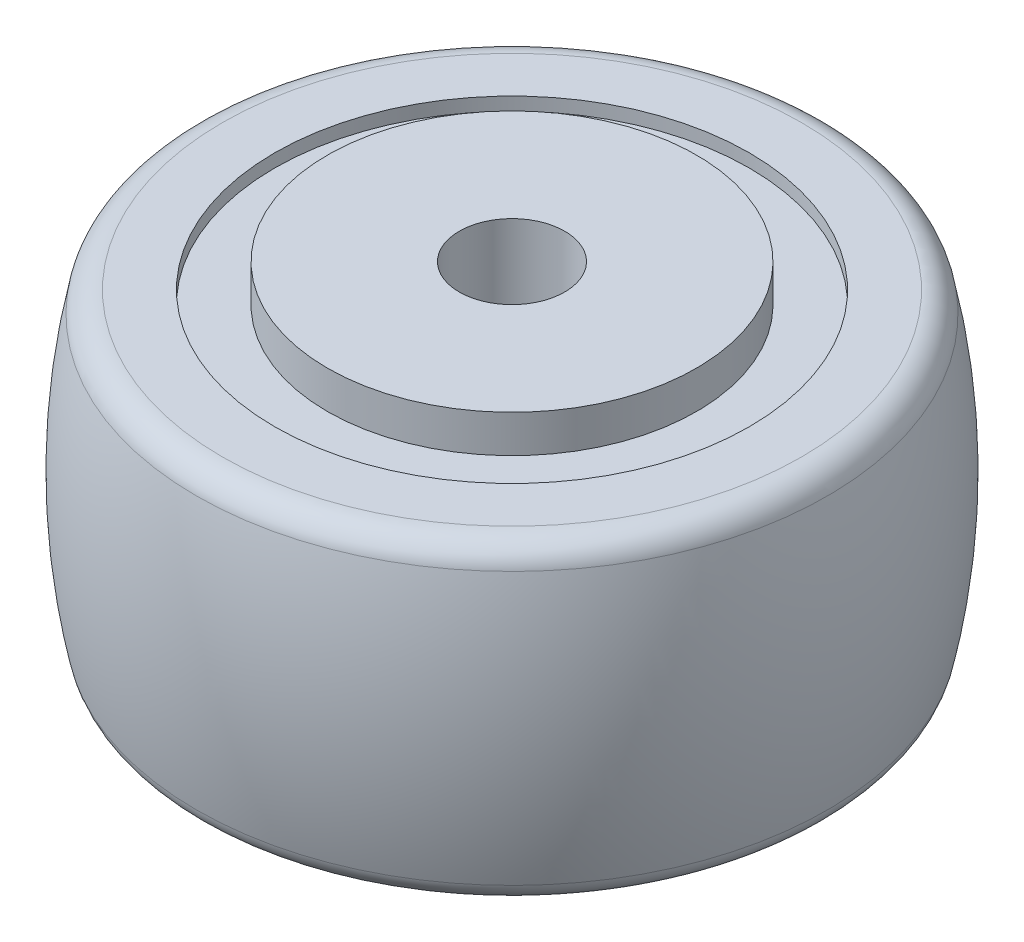
ISO-10303-21;
HEADER;
FILE_DESCRIPTION(('STEP AP214'),'2;1');
FILE_NAME('part.step','',(''),(''),'','','');
FILE_SCHEMA(('AUTOMOTIVE_DESIGN { 1 0 10303 214 1 1 1 1 }'));
ENDSEC;
DATA;
#1=APPLICATION_CONTEXT('core data for automotive mechanical design processes');
#2=APPLICATION_PROTOCOL_DEFINITION('international standard','automotive_design',2000,#1);
#3=PRODUCT_CONTEXT('',#1,'mechanical');
#4=PRODUCT('Part','Part','',(#3));
#5=PRODUCT_RELATED_PRODUCT_CATEGORY('part','',(#4));
#6=PRODUCT_DEFINITION_FORMATION('','',#4);
#7=PRODUCT_DEFINITION_CONTEXT('part definition',#1,'design');
#8=PRODUCT_DEFINITION('design','',#6,#7);
#9=PRODUCT_DEFINITION_SHAPE('','',#8);
#10=(LENGTH_UNIT() NAMED_UNIT(*) SI_UNIT(.MILLI.,.METRE.));
#11=(NAMED_UNIT(*) PLANE_ANGLE_UNIT() SI_UNIT($,.RADIAN.));
#12=(NAMED_UNIT(*) SI_UNIT($,.STERADIAN.) SOLID_ANGLE_UNIT());
#13=UNCERTAINTY_MEASURE_WITH_UNIT(LENGTH_MEASURE(1.E-05),#10,'distance_accuracy_value','');
#14=(GEOMETRIC_REPRESENTATION_CONTEXT(3) GLOBAL_UNCERTAINTY_ASSIGNED_CONTEXT((#13)) GLOBAL_UNIT_ASSIGNED_CONTEXT((#10,
#11,#12)) REPRESENTATION_CONTEXT('',''));
#15=CARTESIAN_POINT('',(0.,0.,0.));
#16=DIRECTION('',(0.,0.,1.));
#17=DIRECTION('',(1.,0.,0.));
#18=AXIS2_PLACEMENT_3D('',#15,#16,#17);
#19=CARTESIAN_POINT('',(0.,-13.75,0.));
#20=DIRECTION('',(0.,1.,0.));
#21=DIRECTION('',(0.,0.,1.));
#22=AXIS2_PLACEMENT_3D('',#19,#20,#21);
#23=CYLINDRICAL_SURFACE('',#22,14.);
#24=CARTESIAN_POINT('',(0.,-13.75,0.));
#25=DIRECTION('',(0.,1.,0.));
#26=DIRECTION('',(0.,0.,1.));
#27=AXIS2_PLACEMENT_3D('',#24,#25,#26);
#28=CIRCLE('',#27,14.);
#29=CARTESIAN_POINT('',(0.,-13.75,14.));
#30=VERTEX_POINT('',#29);
#31=EDGE_CURVE('E10',#30,#30,#28,.T.);
#32=ORIENTED_EDGE('',*,*,#31,.T.);
#33=EDGE_LOOP('',(#32));
#34=FACE_BOUND('',#33,.T.);
#35=CARTESIAN_POINT('',(0.,-10.9,0.));
#36=DIRECTION('',(0.,1.,0.));
#37=DIRECTION('',(0.,0.,1.));
#38=AXIS2_PLACEMENT_3D('',#35,#36,#37);
#39=CIRCLE('',#38,14.);
#40=CARTESIAN_POINT('',(0.,-10.9,14.));
#41=VERTEX_POINT('',#40);
#42=EDGE_CURVE('E105',#41,#41,#39,.T.);
#43=ORIENTED_EDGE('',*,*,#42,.F.);
#44=EDGE_LOOP('',(#43));
#45=FACE_BOUND('',#44,.T.);
#46=ADVANCED_FACE('F43',(#34,#45),#23,.T.);
#47=CARTESIAN_POINT('',(14.,-13.75,0.));
#48=DIRECTION('',(0.,-1.,0.));
#49=DIRECTION('',(0.,0.,-1.));
#50=AXIS2_PLACEMENT_3D('',#47,#48,#49);
#51=PLANE('',#50);
#52=CARTESIAN_POINT('',(0.,-13.75,0.));
#53=DIRECTION('',(0.,1.,0.));
#54=DIRECTION('',(0.,0.,1.));
#55=AXIS2_PLACEMENT_3D('',#52,#53,#54);
#56=CIRCLE('',#55,4.);
#57=CARTESIAN_POINT('',(0.,-13.75,4.));
#58=VERTEX_POINT('',#57);
#59=EDGE_CURVE('E49',#58,#58,#56,.T.);
#60=ORIENTED_EDGE('',*,*,#59,.T.);
#61=EDGE_LOOP('',(#60));
#62=FACE_BOUND('',#61,.T.);
#63=ORIENTED_EDGE('',*,*,#31,.F.);
#64=EDGE_LOOP('',(#63));
#65=FACE_BOUND('',#64,.T.);
#66=ADVANCED_FACE('F112',(#62,#65),#51,.T.);
#67=CARTESIAN_POINT('',(0.,-13.75,0.));
#68=DIRECTION('',(0.,1.,0.));
#69=DIRECTION('',(0.,0.,1.));
#70=AXIS2_PLACEMENT_3D('',#67,#68,#69);
#71=CYLINDRICAL_SURFACE('',#70,4.);
#72=CARTESIAN_POINT('',(0.,13.75,0.));
#73=DIRECTION('',(0.,1.,0.));
#74=DIRECTION('',(0.,0.,1.));
#75=AXIS2_PLACEMENT_3D('',#72,#73,#74);
#76=CIRCLE('',#75,4.);
#77=CARTESIAN_POINT('',(0.,13.75,4.));
#78=VERTEX_POINT('',#77);
#79=EDGE_CURVE('E54',#78,#78,#76,.T.);
#80=ORIENTED_EDGE('',*,*,#79,.T.);
#81=EDGE_LOOP('',(#80));
#82=FACE_BOUND('',#81,.T.);
#83=ORIENTED_EDGE('',*,*,#59,.F.);
#84=EDGE_LOOP('',(#83));
#85=FACE_BOUND('',#84,.T.);
#86=ADVANCED_FACE('F113',(#82,#85),#71,.F.);
#87=CARTESIAN_POINT('',(4.,13.75,0.));
#88=DIRECTION('',(0.,1.,0.));
#89=DIRECTION('',(0.,0.,1.));
#90=AXIS2_PLACEMENT_3D('',#87,#88,#89);
#91=PLANE('',#90);
#92=CARTESIAN_POINT('',(0.,13.75,0.));
#93=DIRECTION('',(0.,1.,0.));
#94=DIRECTION('',(0.,0.,1.));
#95=AXIS2_PLACEMENT_3D('',#92,#93,#94);
#96=CIRCLE('',#95,14.);
#97=CARTESIAN_POINT('',(0.,13.75,14.));
#98=VERTEX_POINT('',#97);
#99=EDGE_CURVE('E58',#98,#98,#96,.T.);
#100=ORIENTED_EDGE('',*,*,#99,.T.);
#101=EDGE_LOOP('',(#100));
#102=FACE_BOUND('',#101,.T.);
#103=ORIENTED_EDGE('',*,*,#79,.F.);
#104=EDGE_LOOP('',(#103));
#105=FACE_BOUND('',#104,.T.);
#106=ADVANCED_FACE('F120',(#102,#105),#91,.T.);
#107=CARTESIAN_POINT('',(0.,-13.75,0.));
#108=DIRECTION('',(0.,1.,0.));
#109=DIRECTION('',(0.,0.,1.));
#110=AXIS2_PLACEMENT_3D('',#107,#108,#109);
#111=CYLINDRICAL_SURFACE('',#110,14.);
#112=CARTESIAN_POINT('',(0.,10.9,0.));
#113=DIRECTION('',(0.,1.,0.));
#114=DIRECTION('',(0.,0.,1.));
#115=AXIS2_PLACEMENT_3D('',#112,#113,#114);
#116=CIRCLE('',#115,14.);
#117=CARTESIAN_POINT('',(0.,10.9,14.));
#118=VERTEX_POINT('',#117);
#119=EDGE_CURVE('E67',#118,#118,#116,.T.);
#120=ORIENTED_EDGE('',*,*,#119,.T.);
#121=EDGE_LOOP('',(#120));
#122=FACE_BOUND('',#121,.T.);
#123=ORIENTED_EDGE('',*,*,#99,.F.);
#124=EDGE_LOOP('',(#123));
#125=FACE_BOUND('',#124,.T.);
#126=ADVANCED_FACE('F127',(#122,#125),#111,.T.);
#127=CARTESIAN_POINT('',(14.,10.9,0.));
#128=DIRECTION('',(0.,1.,0.));
#129=DIRECTION('',(0.,0.,1.));
#130=AXIS2_PLACEMENT_3D('',#127,#128,#129);
#131=PLANE('',#130);
#132=CARTESIAN_POINT('',(0.,10.9,0.));
#133=DIRECTION('',(0.,1.,0.));
#134=DIRECTION('',(0.,0.,1.));
#135=AXIS2_PLACEMENT_3D('',#132,#133,#134);
#136=CIRCLE('',#135,18.);
#137=CARTESIAN_POINT('',(0.,10.9,18.));
#138=VERTEX_POINT('',#137);
#139=EDGE_CURVE('E68',#138,#138,#136,.T.);
#140=ORIENTED_EDGE('',*,*,#139,.T.);
#141=EDGE_LOOP('',(#140));
#142=FACE_BOUND('',#141,.T.);
#143=ORIENTED_EDGE('',*,*,#119,.F.);
#144=EDGE_LOOP('',(#143));
#145=FACE_BOUND('',#144,.T.);
#146=ADVANCED_FACE('F128',(#142,#145),#131,.T.);
#147=CARTESIAN_POINT('',(0.,-13.75,0.));
#148=DIRECTION('',(0.,1.,0.));
#149=DIRECTION('',(0.,0.,1.));
#150=AXIS2_PLACEMENT_3D('',#147,#148,#149);
#151=CYLINDRICAL_SURFACE('',#150,18.);
#152=CARTESIAN_POINT('',(0.,11.9,0.));
#153=DIRECTION('',(0.,1.,0.));
#154=DIRECTION('',(0.,0.,1.));
#155=AXIS2_PLACEMENT_3D('',#152,#153,#154);
#156=CIRCLE('',#155,18.);
#157=CARTESIAN_POINT('',(0.,11.9,18.));
#158=VERTEX_POINT('',#157);
#159=EDGE_CURVE('E74',#158,#158,#156,.T.);
#160=ORIENTED_EDGE('',*,*,#159,.T.);
#161=EDGE_LOOP('',(#160));
#162=FACE_BOUND('',#161,.T.);
#163=ORIENTED_EDGE('',*,*,#139,.F.);
#164=EDGE_LOOP('',(#163));
#165=FACE_BOUND('',#164,.T.);
#166=ADVANCED_FACE('F135',(#162,#165),#151,.F.);
#167=CARTESIAN_POINT('',(18.,11.9,0.));
#168=DIRECTION('',(0.,1.,0.));
#169=DIRECTION('',(0.,0.,1.));
#170=AXIS2_PLACEMENT_3D('',#167,#168,#169);
#171=PLANE('',#170);
#172=CARTESIAN_POINT('',(0.,11.9,0.));
#173=DIRECTION('',(0.,1.,0.));
#174=DIRECTION('',(0.,0.,1.));
#175=AXIS2_PLACEMENT_3D('',#172,#173,#174);
#176=CIRCLE('',#175,21.96796780786);
#177=CARTESIAN_POINT('',(0.,11.9,21.96796780786));
#178=VERTEX_POINT('',#177);
#179=EDGE_CURVE('E77',#178,#178,#176,.T.);
#180=ORIENTED_EDGE('',*,*,#179,.T.);
#181=EDGE_LOOP('',(#180));
#182=FACE_BOUND('',#181,.T.);
#183=ORIENTED_EDGE('',*,*,#159,.F.);
#184=EDGE_LOOP('',(#183));
#185=FACE_BOUND('',#184,.T.);
#186=ADVANCED_FACE('F140',(#182,#185),#171,.T.);
#187=CARTESIAN_POINT('',(0.,9.9,0.));
#188=DIRECTION('',(0.,1.,0.));
#189=DIRECTION('',(0.,0.,1.));
#190=AXIS2_PLACEMENT_3D('',#187,#188,#189);
#191=TOROIDAL_SURFACE('',#190,21.9679678078597,1.99999999999995);
#192=CARTESIAN_POINT('',(0.,10.3125,0.));
#193=DIRECTION('',(0.,1.,0.));
#194=DIRECTION('',(0.,0.,1.));
#195=AXIS2_PLACEMENT_3D('',#192,#193,#194);
#196=CIRCLE('',#195,23.9249664665204);
#197=CARTESIAN_POINT('',(0.,10.3125,23.9249664665204));
#198=VERTEX_POINT('',#197);
#199=EDGE_CURVE('E84',#198,#198,#196,.T.);
#200=ORIENTED_EDGE('',*,*,#199,.T.);
#201=EDGE_LOOP('',(#200));
#202=FACE_BOUND('',#201,.T.);
#203=ORIENTED_EDGE('',*,*,#179,.F.);
#204=EDGE_LOOP('',(#203));
#205=FACE_BOUND('',#204,.T.);
#206=ADVANCED_FACE('F142',(#202,#205),#191,.T.);
#207=CARTESIAN_POINT('',(0.,0.,0.));
#208=DIRECTION('',(0.,1.,0.));
#209=DIRECTION('',(0.,0.,1.));
#210=AXIS2_PLACEMENT_3D('',#207,#208,#209);
#211=DEGENERATE_TOROIDAL_SURFACE('',#210,25.0000000000468,50.0000000000472,.F.);
#212=CARTESIAN_POINT('',(0.,-10.3125000000002,0.));
#213=DIRECTION('',(0.,1.,0.));
#214=DIRECTION('',(0.,0.,1.));
#215=AXIS2_PLACEMENT_3D('',#212,#213,#214);
#216=CIRCLE('',#215,23.9249664665203);
#217=CARTESIAN_POINT('',(0.,-10.3125000000002,23.9249664665203));
#218=VERTEX_POINT('',#217);
#219=EDGE_CURVE('E88',#218,#218,#216,.T.);
#220=ORIENTED_EDGE('',*,*,#219,.T.);
#221=EDGE_LOOP('',(#220));
#222=FACE_BOUND('',#221,.T.);
#223=ORIENTED_EDGE('',*,*,#199,.F.);
#224=EDGE_LOOP('',(#223));
#225=FACE_BOUND('',#224,.T.);
#226=ADVANCED_FACE('F148',(#222,#225),#211,.F.);
#227=CARTESIAN_POINT('',(0.,-9.9,0.));
#228=DIRECTION('',(0.,1.,0.));
#229=DIRECTION('',(0.,0.,1.));
#230=AXIS2_PLACEMENT_3D('',#227,#228,#229);
#231=TOROIDAL_SURFACE('',#230,21.9679678078599,1.99999999999983);
#232=CARTESIAN_POINT('',(0.,-11.8999999999998,0.));
#233=DIRECTION('',(0.,1.,0.));
#234=DIRECTION('',(0.,0.,1.));
#235=AXIS2_PLACEMENT_3D('',#232,#233,#234);
#236=CIRCLE('',#235,21.96796780786);
#237=CARTESIAN_POINT('',(0.,-11.8999999999998,21.96796780786));
#238=VERTEX_POINT('',#237);
#239=EDGE_CURVE('E89',#238,#238,#236,.T.);
#240=ORIENTED_EDGE('',*,*,#239,.T.);
#241=EDGE_LOOP('',(#240));
#242=FACE_BOUND('',#241,.T.);
#243=ORIENTED_EDGE('',*,*,#219,.F.);
#244=EDGE_LOOP('',(#243));
#245=FACE_BOUND('',#244,.T.);
#246=ADVANCED_FACE('F147',(#242,#245),#231,.T.);
#247=CARTESIAN_POINT('',(21.96796780786,-11.8999999999999,0.));
#248=DIRECTION('',(0.,-1.,0.));
#249=DIRECTION('',(0.,0.,-1.));
#250=AXIS2_PLACEMENT_3D('',#247,#248,#249);
#251=PLANE('',#250);
#252=CARTESIAN_POINT('',(0.,-11.9,0.));
#253=DIRECTION('',(0.,1.,0.));
#254=DIRECTION('',(0.,0.,1.));
#255=AXIS2_PLACEMENT_3D('',#252,#253,#254);
#256=CIRCLE('',#255,18.);
#257=CARTESIAN_POINT('',(0.,-11.9,18.));
#258=VERTEX_POINT('',#257);
#259=EDGE_CURVE('E94',#258,#258,#256,.T.);
#260=ORIENTED_EDGE('',*,*,#259,.T.);
#261=EDGE_LOOP('',(#260));
#262=FACE_BOUND('',#261,.T.);
#263=ORIENTED_EDGE('',*,*,#239,.F.);
#264=EDGE_LOOP('',(#263));
#265=FACE_BOUND('',#264,.T.);
#266=ADVANCED_FACE('F152',(#262,#265),#251,.T.);
#267=CARTESIAN_POINT('',(0.,-13.75,0.));
#268=DIRECTION('',(0.,1.,0.));
#269=DIRECTION('',(0.,0.,1.));
#270=AXIS2_PLACEMENT_3D('',#267,#268,#269);
#271=CYLINDRICAL_SURFACE('',#270,18.);
#272=CARTESIAN_POINT('',(0.,-10.9,0.));
#273=DIRECTION('',(0.,1.,0.));
#274=DIRECTION('',(0.,0.,1.));
#275=AXIS2_PLACEMENT_3D('',#272,#273,#274);
#276=CIRCLE('',#275,18.);
#277=CARTESIAN_POINT('',(0.,-10.9,18.));
#278=VERTEX_POINT('',#277);
#279=EDGE_CURVE('E98',#278,#278,#276,.T.);
#280=ORIENTED_EDGE('',*,*,#279,.T.);
#281=EDGE_LOOP('',(#280));
#282=FACE_BOUND('',#281,.T.);
#283=ORIENTED_EDGE('',*,*,#259,.F.);
#284=EDGE_LOOP('',(#283));
#285=FACE_BOUND('',#284,.T.);
#286=ADVANCED_FACE('F158',(#282,#285),#271,.F.);
#287=CARTESIAN_POINT('',(18.,-10.9,0.));
#288=DIRECTION('',(0.,-1.,0.));
#289=DIRECTION('',(0.,0.,-1.));
#290=AXIS2_PLACEMENT_3D('',#287,#288,#289);
#291=PLANE('',#290);
#292=ORIENTED_EDGE('',*,*,#42,.T.);
#293=EDGE_LOOP('',(#292));
#294=FACE_BOUND('',#293,.T.);
#295=ORIENTED_EDGE('',*,*,#279,.F.);
#296=EDGE_LOOP('',(#295));
#297=FACE_BOUND('',#296,.T.);
#298=ADVANCED_FACE('F110',(#294,#297),#291,.T.);
#299=CLOSED_SHELL('',(#46,#66,#86,#106,#126,#146,#166,#186,#206,#226,#246,#266,#286,#298));
#300=MANIFOLD_SOLID_BREP('B2',#299);
#301=ADVANCED_BREP_SHAPE_REPRESENTATION('',(#18,#300),#14);
#302=SHAPE_DEFINITION_REPRESENTATION(#9,#301);
ENDSEC;
END-ISO-10303-21;
